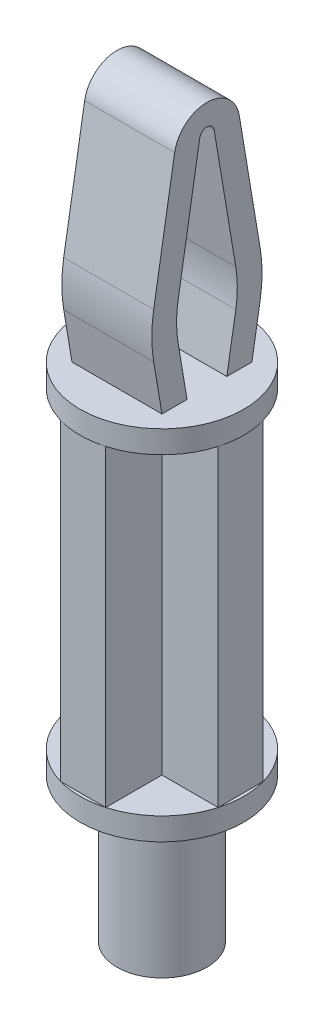
ISO-10303-21;
HEADER;
FILE_DESCRIPTION(('STEP AP214'),'2;1');
FILE_NAME('part.step','',(''),(''),'','','');
FILE_SCHEMA(('AUTOMOTIVE_DESIGN { 1 0 10303 214 1 1 1 1 }'));
ENDSEC;
DATA;
#1=APPLICATION_CONTEXT('core data for automotive mechanical design processes');
#2=APPLICATION_PROTOCOL_DEFINITION('international standard','automotive_design',2000,#1);
#3=PRODUCT_CONTEXT('',#1,'mechanical');
#4=PRODUCT('Part','Part','',(#3));
#5=PRODUCT_RELATED_PRODUCT_CATEGORY('part','',(#4));
#6=PRODUCT_DEFINITION_FORMATION('','',#4);
#7=PRODUCT_DEFINITION_CONTEXT('part definition',#1,'design');
#8=PRODUCT_DEFINITION('design','',#6,#7);
#9=PRODUCT_DEFINITION_SHAPE('','',#8);
#10=(LENGTH_UNIT() NAMED_UNIT(*) SI_UNIT(.MILLI.,.METRE.));
#11=(NAMED_UNIT(*) PLANE_ANGLE_UNIT() SI_UNIT($,.RADIAN.));
#12=(NAMED_UNIT(*) SI_UNIT($,.STERADIAN.) SOLID_ANGLE_UNIT());
#13=UNCERTAINTY_MEASURE_WITH_UNIT(LENGTH_MEASURE(1.E-05),#10,'distance_accuracy_value','');
#14=(GEOMETRIC_REPRESENTATION_CONTEXT(3) GLOBAL_UNCERTAINTY_ASSIGNED_CONTEXT((#13)) GLOBAL_UNIT_ASSIGNED_CONTEXT((#10,
#11,#12)) REPRESENTATION_CONTEXT('',''));
#15=CARTESIAN_POINT('',(0.,0.,0.));
#16=DIRECTION('',(0.,0.,1.));
#17=DIRECTION('',(1.,0.,0.));
#18=AXIS2_PLACEMENT_3D('',#15,#16,#17);
#19=CARTESIAN_POINT('',(0.999999999999998,6.95,-1.00000000000001));
#20=DIRECTION('',(-1.,0.,0.));
#21=DIRECTION('',(0.,0.,1.));
#22=AXIS2_PLACEMENT_3D('',#19,#20,#21);
#23=PLANE('',#22);
#24=DIRECTION('',(0.,0.,-1.));
#25=VECTOR('',#24,1.);
#26=CARTESIAN_POINT('',(0.999999999999998,-6.95,-1.00000000000001));
#27=LINE('',#26,#25);
#28=CARTESIAN_POINT('',(0.999999999999998,-6.95,-1.00000000000001));
#29=VERTEX_POINT('',#28);
#30=CARTESIAN_POINT('',(0.999999999999998,-6.95,-3.5));
#31=VERTEX_POINT('',#30);
#32=EDGE_CURVE('E259',#29,#31,#27,.T.);
#33=ORIENTED_EDGE('',*,*,#32,.T.);
#34=DIRECTION('',(0.,-1.,0.));
#35=VECTOR('',#34,1.);
#36=CARTESIAN_POINT('',(0.999999999999998,6.95,-3.50000000000001));
#37=LINE('',#36,#35);
#38=CARTESIAN_POINT('',(0.999999999999998,6.95,-3.50000000000001));
#39=VERTEX_POINT('',#38);
#40=EDGE_CURVE('E39',#39,#31,#37,.T.);
#41=ORIENTED_EDGE('',*,*,#40,.F.);
#42=DIRECTION('',(0.,0.,-1.));
#43=VECTOR('',#42,1.);
#44=CARTESIAN_POINT('',(0.999999999999998,6.95,-1.00000000000001));
#45=LINE('',#44,#43);
#46=CARTESIAN_POINT('',(0.999999999999998,6.95,-1.00000000000001));
#47=VERTEX_POINT('',#46);
#48=EDGE_CURVE('E264',#47,#39,#45,.T.);
#49=ORIENTED_EDGE('',*,*,#48,.F.);
#50=DIRECTION('',(0.,-1.,0.));
#51=VECTOR('',#50,1.);
#52=CARTESIAN_POINT('',(0.999999999999998,6.95,-1.00000000000001));
#53=LINE('',#52,#51);
#54=EDGE_CURVE('E301',#47,#29,#53,.T.);
#55=ORIENTED_EDGE('',*,*,#54,.T.);
#56=EDGE_LOOP('',(#33,#41,#49,#55));
#57=FACE_BOUND('',#56,.T.);
#58=ADVANCED_FACE('F32',(#57),#23,.F.);
#59=CARTESIAN_POINT('',(-1.,6.95,-3.50000000000001));
#60=DIRECTION('',(0.,0.,1.));
#61=DIRECTION('',(1.,0.,0.));
#62=AXIS2_PLACEMENT_3D('',#59,#60,#61);
#63=PLANE('',#62);
#64=DIRECTION('',(-1.,0.,0.));
#65=VECTOR('',#64,1.);
#66=CARTESIAN_POINT('',(-1.,-6.95,-3.50000000000001));
#67=LINE('',#66,#65);
#68=CARTESIAN_POINT('',(-1.,-6.95,-3.50000000000001));
#69=VERTEX_POINT('',#68);
#70=EDGE_CURVE('E304',#31,#69,#67,.T.);
#71=ORIENTED_EDGE('',*,*,#70,.T.);
#72=DIRECTION('',(0.,-1.,0.));
#73=VECTOR('',#72,1.);
#74=CARTESIAN_POINT('',(-1.,6.95,-3.50000000000001));
#75=LINE('',#74,#73);
#76=CARTESIAN_POINT('',(-1.,6.95,-3.50000000000001));
#77=VERTEX_POINT('',#76);
#78=EDGE_CURVE('E365',#77,#69,#75,.T.);
#79=ORIENTED_EDGE('',*,*,#78,.F.);
#80=DIRECTION('',(-1.,0.,0.));
#81=VECTOR('',#80,1.);
#82=CARTESIAN_POINT('',(-1.,6.95,-3.50000000000001));
#83=LINE('',#82,#81);
#84=EDGE_CURVE('E267',#39,#77,#83,.T.);
#85=ORIENTED_EDGE('',*,*,#84,.F.);
#86=ORIENTED_EDGE('',*,*,#40,.T.);
#87=EDGE_LOOP('',(#71,#79,#85,#86));
#88=FACE_BOUND('',#87,.T.);
#89=ADVANCED_FACE('F370',(#88),#63,.F.);
#90=CARTESIAN_POINT('',(-1.,6.95,-1.00000000000001));
#91=DIRECTION('',(1.,0.,0.));
#92=DIRECTION('',(0.,0.,-1.));
#93=AXIS2_PLACEMENT_3D('',#90,#91,#92);
#94=PLANE('',#93);
#95=DIRECTION('',(0.,0.,1.));
#96=VECTOR('',#95,1.);
#97=CARTESIAN_POINT('',(-1.,-6.95,-1.00000000000001));
#98=LINE('',#97,#96);
#99=CARTESIAN_POINT('',(-1.,-6.95,-1.00000000000001));
#100=VERTEX_POINT('',#99);
#101=EDGE_CURVE('E307',#69,#100,#98,.T.);
#102=ORIENTED_EDGE('',*,*,#101,.T.);
#103=DIRECTION('',(0.,-1.,0.));
#104=VECTOR('',#103,1.);
#105=CARTESIAN_POINT('',(-1.,6.95,-1.00000000000001));
#106=LINE('',#105,#104);
#107=CARTESIAN_POINT('',(-1.,6.95,-1.00000000000001));
#108=VERTEX_POINT('',#107);
#109=EDGE_CURVE('E362',#108,#100,#106,.T.);
#110=ORIENTED_EDGE('',*,*,#109,.F.);
#111=DIRECTION('',(0.,0.,1.));
#112=VECTOR('',#111,1.);
#113=CARTESIAN_POINT('',(-1.,6.95,-1.00000000000001));
#114=LINE('',#113,#112);
#115=EDGE_CURVE('E271',#77,#108,#114,.T.);
#116=ORIENTED_EDGE('',*,*,#115,.F.);
#117=ORIENTED_EDGE('',*,*,#78,.T.);
#118=EDGE_LOOP('',(#102,#110,#116,#117));
#119=FACE_BOUND('',#118,.T.);
#120=ADVANCED_FACE('F438',(#119),#94,.F.);
#121=CARTESIAN_POINT('',(-3.5,6.95,-1.00000000000001));
#122=DIRECTION('',(0.,0.,1.));
#123=DIRECTION('',(1.,0.,0.));
#124=AXIS2_PLACEMENT_3D('',#121,#122,#123);
#125=PLANE('',#124);
#126=DIRECTION('',(-1.,0.,0.));
#127=VECTOR('',#126,1.);
#128=CARTESIAN_POINT('',(-3.5,-6.95,-1.00000000000001));
#129=LINE('',#128,#127);
#130=CARTESIAN_POINT('',(-3.5,-6.95,-1.00000000000001));
#131=VERTEX_POINT('',#130);
#132=EDGE_CURVE('E310',#100,#131,#129,.T.);
#133=ORIENTED_EDGE('',*,*,#132,.T.);
#134=DIRECTION('',(0.,-1.,0.));
#135=VECTOR('',#134,1.);
#136=CARTESIAN_POINT('',(-3.5,6.95,-1.00000000000001));
#137=LINE('',#136,#135);
#138=CARTESIAN_POINT('',(-3.5,6.95,-1.00000000000001));
#139=VERTEX_POINT('',#138);
#140=EDGE_CURVE('E359',#139,#131,#137,.T.);
#141=ORIENTED_EDGE('',*,*,#140,.F.);
#142=DIRECTION('',(-1.,0.,0.));
#143=VECTOR('',#142,1.);
#144=CARTESIAN_POINT('',(-3.5,6.95,-1.00000000000001));
#145=LINE('',#144,#143);
#146=EDGE_CURVE('E274',#108,#139,#145,.T.);
#147=ORIENTED_EDGE('',*,*,#146,.F.);
#148=ORIENTED_EDGE('',*,*,#109,.T.);
#149=EDGE_LOOP('',(#133,#141,#147,#148));
#150=FACE_BOUND('',#149,.T.);
#151=ADVANCED_FACE('F434',(#150),#125,.F.);
#152=CARTESIAN_POINT('',(-3.5,6.95,-1.00000000000001));
#153=DIRECTION('',(1.,0.,0.));
#154=DIRECTION('',(0.,0.,-1.));
#155=AXIS2_PLACEMENT_3D('',#152,#153,#154);
#156=PLANE('',#155);
#157=DIRECTION('',(0.,0.,1.));
#158=VECTOR('',#157,1.);
#159=CARTESIAN_POINT('',(-3.5,-6.95,-1.00000000000001));
#160=LINE('',#159,#158);
#161=CARTESIAN_POINT('',(-3.5,-6.95,0.999999999999992));
#162=VERTEX_POINT('',#161);
#163=EDGE_CURVE('E313',#131,#162,#160,.T.);
#164=ORIENTED_EDGE('',*,*,#163,.T.);
#165=DIRECTION('',(0.,-1.,0.));
#166=VECTOR('',#165,1.);
#167=CARTESIAN_POINT('',(-3.5,6.95,0.999999999999993));
#168=LINE('',#167,#166);
#169=CARTESIAN_POINT('',(-3.5,6.95,0.999999999999993));
#170=VERTEX_POINT('',#169);
#171=EDGE_CURVE('E356',#170,#162,#168,.T.);
#172=ORIENTED_EDGE('',*,*,#171,.F.);
#173=DIRECTION('',(0.,0.,1.));
#174=VECTOR('',#173,1.);
#175=CARTESIAN_POINT('',(-3.5,6.95,-1.00000000000001));
#176=LINE('',#175,#174);
#177=EDGE_CURVE('E277',#139,#170,#176,.T.);
#178=ORIENTED_EDGE('',*,*,#177,.F.);
#179=ORIENTED_EDGE('',*,*,#140,.T.);
#180=EDGE_LOOP('',(#164,#172,#178,#179));
#181=FACE_BOUND('',#180,.T.);
#182=ADVANCED_FACE('F423',(#181),#156,.F.);
#183=CARTESIAN_POINT('',(-3.5,6.95,0.999999999999993));
#184=DIRECTION('',(0.,0.,-1.));
#185=DIRECTION('',(-1.,0.,0.));
#186=AXIS2_PLACEMENT_3D('',#183,#184,#185);
#187=PLANE('',#186);
#188=DIRECTION('',(1.,0.,0.));
#189=VECTOR('',#188,1.);
#190=CARTESIAN_POINT('',(-3.5,-6.95,0.999999999999993));
#191=LINE('',#190,#189);
#192=CARTESIAN_POINT('',(-1.,-6.95,0.999999999999993));
#193=VERTEX_POINT('',#192);
#194=EDGE_CURVE('E316',#162,#193,#191,.T.);
#195=ORIENTED_EDGE('',*,*,#194,.T.);
#196=DIRECTION('',(0.,-1.,0.));
#197=VECTOR('',#196,1.);
#198=CARTESIAN_POINT('',(-1.,6.95,0.999999999999993));
#199=LINE('',#198,#197);
#200=CARTESIAN_POINT('',(-1.,6.95,0.999999999999993));
#201=VERTEX_POINT('',#200);
#202=EDGE_CURVE('E353',#201,#193,#199,.T.);
#203=ORIENTED_EDGE('',*,*,#202,.F.);
#204=DIRECTION('',(1.,0.,0.));
#205=VECTOR('',#204,1.);
#206=CARTESIAN_POINT('',(-3.5,6.95,0.999999999999993));
#207=LINE('',#206,#205);
#208=EDGE_CURVE('E280',#170,#201,#207,.T.);
#209=ORIENTED_EDGE('',*,*,#208,.F.);
#210=ORIENTED_EDGE('',*,*,#171,.T.);
#211=EDGE_LOOP('',(#195,#203,#209,#210));
#212=FACE_BOUND('',#211,.T.);
#213=ADVANCED_FACE('F420',(#212),#187,.F.);
#214=CARTESIAN_POINT('',(-1.,6.95,3.49999999999999));
#215=DIRECTION('',(1.,0.,0.));
#216=DIRECTION('',(0.,0.,-1.));
#217=AXIS2_PLACEMENT_3D('',#214,#215,#216);
#218=PLANE('',#217);
#219=DIRECTION('',(0.,0.,1.));
#220=VECTOR('',#219,1.);
#221=CARTESIAN_POINT('',(-1.,-6.95,3.49999999999999));
#222=LINE('',#221,#220);
#223=CARTESIAN_POINT('',(-1.,-6.95,3.5));
#224=VERTEX_POINT('',#223);
#225=EDGE_CURVE('E319',#193,#224,#222,.T.);
#226=ORIENTED_EDGE('',*,*,#225,.T.);
#227=DIRECTION('',(0.,-1.,0.));
#228=VECTOR('',#227,1.);
#229=CARTESIAN_POINT('',(-1.,6.95,3.49999999999999));
#230=LINE('',#229,#228);
#231=CARTESIAN_POINT('',(-1.,6.95,3.49999999999999));
#232=VERTEX_POINT('',#231);
#233=EDGE_CURVE('E350',#232,#224,#230,.T.);
#234=ORIENTED_EDGE('',*,*,#233,.F.);
#235=DIRECTION('',(0.,0.,1.));
#236=VECTOR('',#235,1.);
#237=CARTESIAN_POINT('',(-1.,6.95,3.49999999999999));
#238=LINE('',#237,#236);
#239=EDGE_CURVE('E283',#201,#232,#238,.T.);
#240=ORIENTED_EDGE('',*,*,#239,.F.);
#241=ORIENTED_EDGE('',*,*,#202,.T.);
#242=EDGE_LOOP('',(#226,#234,#240,#241));
#243=FACE_BOUND('',#242,.T.);
#244=ADVANCED_FACE('F416',(#243),#218,.F.);
#245=CARTESIAN_POINT('',(-1.,6.95,3.49999999999999));
#246=DIRECTION('',(0.,0.,-1.));
#247=DIRECTION('',(-1.,0.,0.));
#248=AXIS2_PLACEMENT_3D('',#245,#246,#247);
#249=PLANE('',#248);
#250=DIRECTION('',(1.,0.,0.));
#251=VECTOR('',#250,1.);
#252=CARTESIAN_POINT('',(-1.,-6.95,3.49999999999999));
#253=LINE('',#252,#251);
#254=CARTESIAN_POINT('',(1.00000000000002,-6.95,3.49999999999999));
#255=VERTEX_POINT('',#254);
#256=EDGE_CURVE('E322',#224,#255,#253,.T.);
#257=ORIENTED_EDGE('',*,*,#256,.T.);
#258=DIRECTION('',(0.,-1.,0.));
#259=VECTOR('',#258,1.);
#260=CARTESIAN_POINT('',(0.999999999999998,6.95,3.49999999999999));
#261=LINE('',#260,#259);
#262=CARTESIAN_POINT('',(0.999999999999998,6.95,3.49999999999999));
#263=VERTEX_POINT('',#262);
#264=EDGE_CURVE('E347',#263,#255,#261,.T.);
#265=ORIENTED_EDGE('',*,*,#264,.F.);
#266=DIRECTION('',(1.,0.,0.));
#267=VECTOR('',#266,1.);
#268=CARTESIAN_POINT('',(-1.,6.95,3.49999999999999));
#269=LINE('',#268,#267);
#270=EDGE_CURVE('E286',#232,#263,#269,.T.);
#271=ORIENTED_EDGE('',*,*,#270,.F.);
#272=ORIENTED_EDGE('',*,*,#233,.T.);
#273=EDGE_LOOP('',(#257,#265,#271,#272));
#274=FACE_BOUND('',#273,.T.);
#275=ADVANCED_FACE('F404',(#274),#249,.F.);
#276=CARTESIAN_POINT('',(0.999999999999998,6.95,3.49999999999999));
#277=DIRECTION('',(-1.,0.,0.));
#278=DIRECTION('',(0.,0.,1.));
#279=AXIS2_PLACEMENT_3D('',#276,#277,#278);
#280=PLANE('',#279);
#281=DIRECTION('',(0.,0.,-1.));
#282=VECTOR('',#281,1.);
#283=CARTESIAN_POINT('',(0.999999999999998,-6.95,3.49999999999999));
#284=LINE('',#283,#282);
#285=CARTESIAN_POINT('',(0.999999999999998,-6.95,0.999999999999993));
#286=VERTEX_POINT('',#285);
#287=EDGE_CURVE('E325',#255,#286,#284,.T.);
#288=ORIENTED_EDGE('',*,*,#287,.T.);
#289=DIRECTION('',(0.,-1.,0.));
#290=VECTOR('',#289,1.);
#291=CARTESIAN_POINT('',(0.999999999999998,6.95,0.999999999999993));
#292=LINE('',#291,#290);
#293=CARTESIAN_POINT('',(0.999999999999998,6.95,0.999999999999993));
#294=VERTEX_POINT('',#293);
#295=EDGE_CURVE('E344',#294,#286,#292,.T.);
#296=ORIENTED_EDGE('',*,*,#295,.F.);
#297=DIRECTION('',(0.,0.,-1.));
#298=VECTOR('',#297,1.);
#299=CARTESIAN_POINT('',(0.999999999999998,6.95,3.49999999999999));
#300=LINE('',#299,#298);
#301=EDGE_CURVE('E289',#263,#294,#300,.T.);
#302=ORIENTED_EDGE('',*,*,#301,.F.);
#303=ORIENTED_EDGE('',*,*,#264,.T.);
#304=EDGE_LOOP('',(#288,#296,#302,#303));
#305=FACE_BOUND('',#304,.T.);
#306=ADVANCED_FACE('F401',(#305),#280,.F.);
#307=CARTESIAN_POINT('',(0.999999999999998,6.95,0.999999999999993));
#308=DIRECTION('',(0.,0.,-1.));
#309=DIRECTION('',(-1.,0.,0.));
#310=AXIS2_PLACEMENT_3D('',#307,#308,#309);
#311=PLANE('',#310);
#312=DIRECTION('',(1.,0.,0.));
#313=VECTOR('',#312,1.);
#314=CARTESIAN_POINT('',(0.999999999999998,-6.95,0.999999999999993));
#315=LINE('',#314,#313);
#316=CARTESIAN_POINT('',(3.5,-6.95,0.999999999999994));
#317=VERTEX_POINT('',#316);
#318=EDGE_CURVE('E328',#286,#317,#315,.T.);
#319=ORIENTED_EDGE('',*,*,#318,.T.);
#320=DIRECTION('',(0.,-1.,0.));
#321=VECTOR('',#320,1.);
#322=CARTESIAN_POINT('',(3.5,6.95,0.999999999999993));
#323=LINE('',#322,#321);
#324=CARTESIAN_POINT('',(3.5,6.95,0.999999999999993));
#325=VERTEX_POINT('',#324);
#326=EDGE_CURVE('E341',#325,#317,#323,.T.);
#327=ORIENTED_EDGE('',*,*,#326,.F.);
#328=DIRECTION('',(1.,0.,0.));
#329=VECTOR('',#328,1.);
#330=CARTESIAN_POINT('',(0.999999999999998,6.95,0.999999999999993));
#331=LINE('',#330,#329);
#332=EDGE_CURVE('E292',#294,#325,#331,.T.);
#333=ORIENTED_EDGE('',*,*,#332,.F.);
#334=ORIENTED_EDGE('',*,*,#295,.T.);
#335=EDGE_LOOP('',(#319,#327,#333,#334));
#336=FACE_BOUND('',#335,.T.);
#337=ADVANCED_FACE('F397',(#336),#311,.F.);
#338=CARTESIAN_POINT('',(3.5,6.95,-1.00000000000001));
#339=DIRECTION('',(-1.,0.,0.));
#340=DIRECTION('',(0.,0.,1.));
#341=AXIS2_PLACEMENT_3D('',#338,#339,#340);
#342=PLANE('',#341);
#343=DIRECTION('',(0.,0.,-1.));
#344=VECTOR('',#343,1.);
#345=CARTESIAN_POINT('',(3.5,-6.95,-1.00000000000001));
#346=LINE('',#345,#344);
#347=CARTESIAN_POINT('',(3.5,-6.95,-1.00000000000001));
#348=VERTEX_POINT('',#347);
#349=EDGE_CURVE('E331',#317,#348,#346,.T.);
#350=ORIENTED_EDGE('',*,*,#349,.T.);
#351=DIRECTION('',(0.,-1.,0.));
#352=VECTOR('',#351,1.);
#353=CARTESIAN_POINT('',(3.5,6.95,-1.00000000000001));
#354=LINE('',#353,#352);
#355=CARTESIAN_POINT('',(3.5,6.95,-1.00000000000001));
#356=VERTEX_POINT('',#355);
#357=EDGE_CURVE('E338',#356,#348,#354,.T.);
#358=ORIENTED_EDGE('',*,*,#357,.F.);
#359=DIRECTION('',(0.,0.,-1.));
#360=VECTOR('',#359,1.);
#361=CARTESIAN_POINT('',(3.5,6.95,-1.00000000000001));
#362=LINE('',#361,#360);
#363=EDGE_CURVE('E295',#325,#356,#362,.T.);
#364=ORIENTED_EDGE('',*,*,#363,.F.);
#365=ORIENTED_EDGE('',*,*,#326,.T.);
#366=EDGE_LOOP('',(#350,#358,#364,#365));
#367=FACE_BOUND('',#366,.T.);
#368=ADVANCED_FACE('F383',(#367),#342,.F.);
#369=CARTESIAN_POINT('',(0.999999999999998,6.95,-1.00000000000001));
#370=DIRECTION('',(0.,0.,1.));
#371=DIRECTION('',(1.,0.,0.));
#372=AXIS2_PLACEMENT_3D('',#369,#370,#371);
#373=PLANE('',#372);
#374=DIRECTION('',(-1.,0.,0.));
#375=VECTOR('',#374,1.);
#376=CARTESIAN_POINT('',(0.999999999999998,-6.95,-1.00000000000001));
#377=LINE('',#376,#375);
#378=EDGE_CURVE('E268',#348,#29,#377,.T.);
#379=ORIENTED_EDGE('',*,*,#378,.T.);
#380=ORIENTED_EDGE('',*,*,#54,.F.);
#381=DIRECTION('',(-1.,0.,0.));
#382=VECTOR('',#381,1.);
#383=CARTESIAN_POINT('',(0.999999999999998,6.95,-1.00000000000001));
#384=LINE('',#383,#382);
#385=EDGE_CURVE('E298',#356,#47,#384,.T.);
#386=ORIENTED_EDGE('',*,*,#385,.F.);
#387=ORIENTED_EDGE('',*,*,#357,.T.);
#388=EDGE_LOOP('',(#379,#380,#386,#387));
#389=FACE_BOUND('',#388,.T.);
#390=ADVANCED_FACE('F379',(#389),#373,.F.);
#391=CARTESIAN_POINT('',(0.,6.95,0.));
#392=DIRECTION('',(0.,1.,0.));
#393=DIRECTION('',(0.,0.,1.));
#394=AXIS2_PLACEMENT_3D('',#391,#392,#393);
#395=PLANE('',#394);
#396=ORIENTED_EDGE('',*,*,#385,.T.);
#397=ORIENTED_EDGE('',*,*,#48,.T.);
#398=CARTESIAN_POINT('',(0.,6.95,0.));
#399=DIRECTION('',(0.,1.,0.));
#400=DIRECTION('',(0.,0.,1.));
#401=AXIS2_PLACEMENT_3D('',#398,#399,#400);
#402=CIRCLE('',#401,3.64005494464026);
#403=EDGE_CURVE('E457',#356,#39,#402,.T.);
#404=ORIENTED_EDGE('',*,*,#403,.F.);
#405=EDGE_LOOP('',(#396,#397,#404));
#406=FACE_BOUND('',#405,.T.);
#407=ADVANCED_FACE('F464',(#406),#395,.F.);
#408=EDGE_CURVE('E445',#39,#77,#402,.T.);
#409=ORIENTED_EDGE('',*,*,#408,.F.);
#410=ORIENTED_EDGE('',*,*,#84,.T.);
#411=EDGE_LOOP('',(#409,#410));
#412=FACE_BOUND('',#411,.T.);
#413=ADVANCED_FACE('F443',(#412),#395,.F.);
#414=EDGE_CURVE('E448',#77,#139,#402,.T.);
#415=ORIENTED_EDGE('',*,*,#414,.F.);
#416=ORIENTED_EDGE('',*,*,#115,.T.);
#417=ORIENTED_EDGE('',*,*,#146,.T.);
#418=EDGE_LOOP('',(#415,#416,#417));
#419=FACE_BOUND('',#418,.T.);
#420=ADVANCED_FACE('F449',(#419),#395,.F.);
#421=EDGE_CURVE('E453',#139,#170,#402,.T.);
#422=ORIENTED_EDGE('',*,*,#421,.F.);
#423=ORIENTED_EDGE('',*,*,#177,.T.);
#424=EDGE_LOOP('',(#422,#423));
#425=FACE_BOUND('',#424,.T.);
#426=ADVANCED_FACE('F773',(#425),#395,.F.);
#427=EDGE_CURVE('E873',#170,#232,#402,.T.);
#428=ORIENTED_EDGE('',*,*,#427,.F.);
#429=ORIENTED_EDGE('',*,*,#208,.T.);
#430=ORIENTED_EDGE('',*,*,#239,.T.);
#431=EDGE_LOOP('',(#428,#429,#430));
#432=FACE_BOUND('',#431,.T.);
#433=ADVANCED_FACE('F765',(#432),#395,.F.);
#434=EDGE_CURVE('E251',#232,#263,#402,.T.);
#435=ORIENTED_EDGE('',*,*,#434,.F.);
#436=ORIENTED_EDGE('',*,*,#270,.T.);
#437=EDGE_LOOP('',(#435,#436));
#438=FACE_BOUND('',#437,.T.);
#439=ADVANCED_FACE('F757',(#438),#395,.F.);
#440=EDGE_CURVE('E260',#263,#325,#402,.T.);
#441=ORIENTED_EDGE('',*,*,#440,.F.);
#442=ORIENTED_EDGE('',*,*,#301,.T.);
#443=ORIENTED_EDGE('',*,*,#332,.T.);
#444=EDGE_LOOP('',(#441,#442,#443));
#445=FACE_BOUND('',#444,.T.);
#446=ADVANCED_FACE('F475',(#445),#395,.F.);
#447=EDGE_CURVE('E263',#325,#356,#402,.T.);
#448=ORIENTED_EDGE('',*,*,#447,.F.);
#449=ORIENTED_EDGE('',*,*,#363,.T.);
#450=EDGE_LOOP('',(#448,#449));
#451=FACE_BOUND('',#450,.T.);
#452=ADVANCED_FACE('F462',(#451),#395,.F.);
#453=CARTESIAN_POINT('',(0.,7.95,0.));
#454=DIRECTION('',(0.,-1.,0.));
#455=DIRECTION('',(0.,0.,-1.));
#456=AXIS2_PLACEMENT_3D('',#453,#454,#455);
#457=CYLINDRICAL_SURFACE('',#456,3.64005494464026);
#458=CARTESIAN_POINT('',(0.,7.95,0.));
#459=DIRECTION('',(0.,1.,0.));
#460=DIRECTION('',(0.,0.,1.));
#461=AXIS2_PLACEMENT_3D('',#458,#459,#460);
#462=CIRCLE('',#461,3.64005494464026);
#463=CARTESIAN_POINT('',(0.,7.95,3.64005494464026));
#464=VERTEX_POINT('',#463);
#465=EDGE_CURVE('E256',#464,#464,#462,.T.);
#466=ORIENTED_EDGE('',*,*,#465,.F.);
#467=EDGE_LOOP('',(#466));
#468=FACE_BOUND('',#467,.T.);
#469=ORIENTED_EDGE('',*,*,#440,.T.);
#470=ORIENTED_EDGE('',*,*,#447,.T.);
#471=ORIENTED_EDGE('',*,*,#403,.T.);
#472=ORIENTED_EDGE('',*,*,#408,.T.);
#473=ORIENTED_EDGE('',*,*,#414,.T.);
#474=ORIENTED_EDGE('',*,*,#421,.T.);
#475=ORIENTED_EDGE('',*,*,#427,.T.);
#476=ORIENTED_EDGE('',*,*,#434,.T.);
#477=EDGE_LOOP('',(#469,#470,#471,#472,#473,#474,#475,#476));
#478=FACE_BOUND('',#477,.T.);
#479=ADVANCED_FACE('F454',(#468,#478),#457,.T.);
#480=CARTESIAN_POINT('',(0.,7.95,0.));
#481=DIRECTION('',(0.,1.,0.));
#482=DIRECTION('',(0.,0.,1.));
#483=AXIS2_PLACEMENT_3D('',#480,#481,#482);
#484=PLANE('',#483);
#485=DIRECTION('',(0.,0.,-1.));
#486=VECTOR('',#485,1.);
#487=CARTESIAN_POINT('',(2.,7.95,2.));
#488=LINE('',#487,#486);
#489=CARTESIAN_POINT('',(2.,7.95,2.));
#490=VERTEX_POINT('',#489);
#491=CARTESIAN_POINT('',(2.,7.95,0.884760215263712));
#492=VERTEX_POINT('',#491);
#493=EDGE_CURVE('E223',#490,#492,#488,.T.);
#494=ORIENTED_EDGE('',*,*,#493,.F.);
#495=DIRECTION('',(-1.,0.,0.));
#496=VECTOR('',#495,1.);
#497=CARTESIAN_POINT('',(2.,7.95,2.));
#498=LINE('',#497,#496);
#499=CARTESIAN_POINT('',(-2.,7.95,2.));
#500=VERTEX_POINT('',#499);
#501=EDGE_CURVE('E905',#490,#500,#498,.T.);
#502=ORIENTED_EDGE('',*,*,#501,.T.);
#503=DIRECTION('',(0.,0.,-1.));
#504=VECTOR('',#503,1.);
#505=CARTESIAN_POINT('',(-2.,7.95,2.));
#506=LINE('',#505,#504);
#507=CARTESIAN_POINT('',(-2.,7.95,0.884760215263712));
#508=VERTEX_POINT('',#507);
#509=EDGE_CURVE('E238',#500,#508,#506,.T.);
#510=ORIENTED_EDGE('',*,*,#509,.T.);
#511=DIRECTION('',(-1.,0.,0.));
#512=VECTOR('',#511,1.);
#513=CARTESIAN_POINT('',(2.,7.95,0.884760215263712));
#514=LINE('',#513,#512);
#515=EDGE_CURVE('E46',#492,#508,#514,.T.);
#516=ORIENTED_EDGE('',*,*,#515,.F.);
#517=EDGE_LOOP('',(#494,#502,#510,#516));
#518=FACE_BOUND('',#517,.T.);
#519=DIRECTION('',(0.,0.,-1.));
#520=VECTOR('',#519,1.);
#521=CARTESIAN_POINT('',(2.,7.95,-0.884760215263712));
#522=LINE('',#521,#520);
#523=CARTESIAN_POINT('',(2.,7.95,-0.884760215263712));
#524=VERTEX_POINT('',#523);
#525=CARTESIAN_POINT('',(2.,7.95,-2.));
#526=VERTEX_POINT('',#525);
#527=EDGE_CURVE('E999',#524,#526,#522,.T.);
#528=ORIENTED_EDGE('',*,*,#527,.F.);
#529=DIRECTION('',(-1.,0.,0.));
#530=VECTOR('',#529,1.);
#531=CARTESIAN_POINT('',(2.,7.95,-0.884760215263712));
#532=LINE('',#531,#530);
#533=CARTESIAN_POINT('',(-2.,7.95,-0.884760215263712));
#534=VERTEX_POINT('',#533);
#535=EDGE_CURVE('E932',#524,#534,#532,.T.);
#536=ORIENTED_EDGE('',*,*,#535,.T.);
#537=DIRECTION('',(0.,0.,-1.));
#538=VECTOR('',#537,1.);
#539=CARTESIAN_POINT('',(-2.,7.95,-0.884760215263712));
#540=LINE('',#539,#538);
#541=CARTESIAN_POINT('',(-2.,7.95,-2.));
#542=VERTEX_POINT('',#541);
#543=EDGE_CURVE('E968',#534,#542,#540,.T.);
#544=ORIENTED_EDGE('',*,*,#543,.T.);
#545=DIRECTION('',(-1.,0.,0.));
#546=VECTOR('',#545,1.);
#547=CARTESIAN_POINT('',(2.,7.95,-2.));
#548=LINE('',#547,#546);
#549=EDGE_CURVE('E930',#526,#542,#548,.T.);
#550=ORIENTED_EDGE('',*,*,#549,.F.);
#551=EDGE_LOOP('',(#528,#536,#544,#550));
#552=FACE_BOUND('',#551,.T.);
#553=ORIENTED_EDGE('',*,*,#465,.T.);
#554=EDGE_LOOP('',(#553));
#555=FACE_BOUND('',#554,.T.);
#556=ADVANCED_FACE('F235',(#518,#552,#555),#484,.T.);
#557=CARTESIAN_POINT('',(0.,-6.95,0.));
#558=DIRECTION('',(0.,-1.,0.));
#559=DIRECTION('',(0.,0.,1.));
#560=AXIS2_PLACEMENT_3D('',#557,#558,#559);
#561=PLANE('',#560);
#562=ORIENTED_EDGE('',*,*,#32,.F.);
#563=ORIENTED_EDGE('',*,*,#378,.F.);
#564=CARTESIAN_POINT('',(0.,-6.95,0.));
#565=DIRECTION('',(0.,1.,0.));
#566=DIRECTION('',(0.,0.,1.));
#567=AXIS2_PLACEMENT_3D('',#564,#565,#566);
#568=CIRCLE('',#567,3.64005494464026);
#569=EDGE_CURVE('E377',#348,#31,#568,.T.);
#570=ORIENTED_EDGE('',*,*,#569,.T.);
#571=EDGE_LOOP('',(#562,#563,#570));
#572=FACE_BOUND('',#571,.T.);
#573=ADVANCED_FACE('F375',(#572),#561,.F.);
#574=ORIENTED_EDGE('',*,*,#349,.F.);
#575=EDGE_CURVE('E255',#317,#348,#568,.T.);
#576=ORIENTED_EDGE('',*,*,#575,.T.);
#577=EDGE_LOOP('',(#574,#576));
#578=FACE_BOUND('',#577,.T.);
#579=ADVANCED_FACE('F387',(#578),#561,.F.);
#580=ORIENTED_EDGE('',*,*,#318,.F.);
#581=ORIENTED_EDGE('',*,*,#287,.F.);
#582=EDGE_CURVE('E252',#255,#317,#568,.T.);
#583=ORIENTED_EDGE('',*,*,#582,.T.);
#584=EDGE_LOOP('',(#580,#581,#583));
#585=FACE_BOUND('',#584,.T.);
#586=ADVANCED_FACE('F394',(#585),#561,.F.);
#587=ORIENTED_EDGE('',*,*,#256,.F.);
#588=EDGE_CURVE('E242',#224,#255,#568,.T.);
#589=ORIENTED_EDGE('',*,*,#588,.T.);
#590=EDGE_LOOP('',(#587,#589));
#591=FACE_BOUND('',#590,.T.);
#592=ADVANCED_FACE('F406',(#591),#561,.F.);
#593=ORIENTED_EDGE('',*,*,#225,.F.);
#594=ORIENTED_EDGE('',*,*,#194,.F.);
#595=EDGE_CURVE('E410',#162,#224,#568,.T.);
#596=ORIENTED_EDGE('',*,*,#595,.T.);
#597=EDGE_LOOP('',(#593,#594,#596));
#598=FACE_BOUND('',#597,.T.);
#599=ADVANCED_FACE('F413',(#598),#561,.F.);
#600=ORIENTED_EDGE('',*,*,#163,.F.);
#601=EDGE_CURVE('E414',#131,#162,#568,.T.);
#602=ORIENTED_EDGE('',*,*,#601,.T.);
#603=EDGE_LOOP('',(#600,#602));
#604=FACE_BOUND('',#603,.T.);
#605=ADVANCED_FACE('F425',(#604),#561,.F.);
#606=ORIENTED_EDGE('',*,*,#132,.F.);
#607=ORIENTED_EDGE('',*,*,#101,.F.);
#608=EDGE_CURVE('E428',#69,#131,#568,.T.);
#609=ORIENTED_EDGE('',*,*,#608,.T.);
#610=EDGE_LOOP('',(#606,#607,#609));
#611=FACE_BOUND('',#610,.T.);
#612=ADVANCED_FACE('F431',(#611),#561,.F.);
#613=CARTESIAN_POINT('',(0.,-7.95,0.));
#614=DIRECTION('',(0.,1.,0.));
#615=DIRECTION('',(0.,0.,1.));
#616=AXIS2_PLACEMENT_3D('',#613,#614,#615);
#617=CYLINDRICAL_SURFACE('',#616,3.64005494464026);
#618=CARTESIAN_POINT('',(0.,-7.95,0.));
#619=DIRECTION('',(0.,1.,0.));
#620=DIRECTION('',(0.,0.,1.));
#621=AXIS2_PLACEMENT_3D('',#618,#619,#620);
#622=CIRCLE('',#621,3.64005494464026);
#623=CARTESIAN_POINT('',(0.,-7.95,3.64005494464026));
#624=VERTEX_POINT('',#623);
#625=EDGE_CURVE('E248',#624,#624,#622,.T.);
#626=ORIENTED_EDGE('',*,*,#625,.T.);
#627=EDGE_LOOP('',(#626));
#628=FACE_BOUND('',#627,.T.);
#629=ORIENTED_EDGE('',*,*,#582,.F.);
#630=ORIENTED_EDGE('',*,*,#588,.F.);
#631=ORIENTED_EDGE('',*,*,#595,.F.);
#632=ORIENTED_EDGE('',*,*,#601,.F.);
#633=ORIENTED_EDGE('',*,*,#608,.F.);
#634=EDGE_CURVE('E432',#31,#69,#568,.T.);
#635=ORIENTED_EDGE('',*,*,#634,.F.);
#636=ORIENTED_EDGE('',*,*,#569,.F.);
#637=ORIENTED_EDGE('',*,*,#575,.F.);
#638=EDGE_LOOP('',(#629,#630,#631,#632,#633,#635,#636,#637));
#639=FACE_BOUND('',#638,.T.);
#640=ADVANCED_FACE('F390',(#628,#639),#617,.T.);
#641=CARTESIAN_POINT('',(0.,-7.95,0.));
#642=DIRECTION('',(0.,-1.,0.));
#643=DIRECTION('',(0.,0.,1.));
#644=AXIS2_PLACEMENT_3D('',#641,#642,#643);
#645=PLANE('',#644);
#646=CARTESIAN_POINT('',(0.,-7.95,0.));
#647=DIRECTION('',(0.,-1.,0.));
#648=DIRECTION('',(0.,0.,-1.));
#649=AXIS2_PLACEMENT_3D('',#646,#647,#648);
#650=CIRCLE('',#649,2.);
#651=CARTESIAN_POINT('',(0.,-7.95,-2.));
#652=VERTEX_POINT('',#651);
#653=EDGE_CURVE('E11',#652,#652,#650,.T.);
#654=ORIENTED_EDGE('',*,*,#653,.F.);
#655=EDGE_LOOP('',(#654));
#656=FACE_BOUND('',#655,.T.);
#657=ORIENTED_EDGE('',*,*,#625,.F.);
#658=EDGE_LOOP('',(#657));
#659=FACE_BOUND('',#658,.T.);
#660=ADVANCED_FACE('F514',(#656,#659),#645,.T.);
#661=ORIENTED_EDGE('',*,*,#70,.F.);
#662=ORIENTED_EDGE('',*,*,#634,.T.);
#663=EDGE_LOOP('',(#661,#662));
#664=FACE_BOUND('',#663,.T.);
#665=ADVANCED_FACE('F511',(#664),#561,.F.);
#666=CARTESIAN_POINT('',(0.,-14.35,0.));
#667=DIRECTION('',(0.,1.,0.));
#668=DIRECTION('',(0.,0.,1.));
#669=AXIS2_PLACEMENT_3D('',#666,#667,#668);
#670=CYLINDRICAL_SURFACE('',#669,2.);
#671=CARTESIAN_POINT('',(0.,-14.35,0.));
#672=DIRECTION('',(0.,1.,0.));
#673=DIRECTION('',(0.,0.,1.));
#674=AXIS2_PLACEMENT_3D('',#671,#672,#673);
#675=CIRCLE('',#674,2.);
#676=CARTESIAN_POINT('',(0.,-14.35,2.));
#677=VERTEX_POINT('',#676);
#678=EDGE_CURVE('E239',#677,#677,#675,.T.);
#679=ORIENTED_EDGE('',*,*,#678,.T.);
#680=EDGE_LOOP('',(#679));
#681=FACE_BOUND('',#680,.T.);
#682=ORIENTED_EDGE('',*,*,#653,.T.);
#683=EDGE_LOOP('',(#682));
#684=FACE_BOUND('',#683,.T.);
#685=ADVANCED_FACE('F518',(#681,#684),#670,.T.);
#686=CARTESIAN_POINT('',(0.,-14.35,0.));
#687=DIRECTION('',(0.,1.,0.));
#688=DIRECTION('',(0.,0.,1.));
#689=AXIS2_PLACEMENT_3D('',#686,#687,#688);
#690=PLANE('',#689);
#691=ORIENTED_EDGE('',*,*,#678,.F.);
#692=EDGE_LOOP('',(#691));
#693=FACE_BOUND('',#692,.T.);
#694=ADVANCED_FACE('F525',(#693),#690,.F.);
#695=CARTESIAN_POINT('',(2.,7.95,0.884760215263712));
#696=DIRECTION('',(0.,-0.164752317993209,0.98633497034013));
#697=DIRECTION('',(0.,-0.98633497034013,-0.164752317993209));
#698=AXIS2_PLACEMENT_3D('',#695,#696,#697);
#699=PLANE('',#698);
#700=DIRECTION('',(0.,0.98633497034013,0.164752317993209));
#701=VECTOR('',#700,1.);
#702=CARTESIAN_POINT('',(-2.,7.95,0.884760215263712));
#703=LINE('',#702,#701);
#704=CARTESIAN_POINT('',(-2.,10.326238410034,1.28167485170065));
#705=VERTEX_POINT('',#704);
#706=EDGE_CURVE('E903',#508,#705,#703,.T.);
#707=ORIENTED_EDGE('',*,*,#706,.T.);
#708=DIRECTION('',(-1.,0.,0.));
#709=VECTOR('',#708,1.);
#710=CARTESIAN_POINT('',(2.,10.326238410034,1.28167485170065));
#711=LINE('',#710,#709);
#712=CARTESIAN_POINT('',(2.,10.326238410034,1.28167485170065));
#713=VERTEX_POINT('',#712);
#714=EDGE_CURVE('E219',#713,#705,#711,.T.);
#715=ORIENTED_EDGE('',*,*,#714,.F.);
#716=DIRECTION('',(0.,0.98633497034013,0.164752317993209));
#717=VECTOR('',#716,1.);
#718=CARTESIAN_POINT('',(2.,7.95,0.884760215263712));
#719=LINE('',#718,#717);
#720=EDGE_CURVE('E215',#492,#713,#719,.T.);
#721=ORIENTED_EDGE('',*,*,#720,.F.);
#722=ORIENTED_EDGE('',*,*,#515,.T.);
#723=EDGE_LOOP('',(#707,#715,#721,#722));
#724=FACE_BOUND('',#723,.T.);
#725=ADVANCED_FACE('F217',(#724),#699,.F.);
#726=CARTESIAN_POINT('',(2.,11.15,-3.65));
#727=DIRECTION('',(-1.,0.,0.));
#728=DIRECTION('',(0.,0.,1.));
#729=AXIS2_PLACEMENT_3D('',#726,#727,#728);
#730=CYLINDRICAL_SURFACE('',#729,5.);
#731=CARTESIAN_POINT('',(-2.,11.15,-3.65));
#732=DIRECTION('',(-1.,0.,0.));
#733=DIRECTION('',(0.,0.,-1.));
#734=AXIS2_PLACEMENT_3D('',#731,#732,#733);
#735=CIRCLE('',#734,5.);
#736=CARTESIAN_POINT('',(-2.,11.973761589966,1.28167485170065));
#737=VERTEX_POINT('',#736);
#738=EDGE_CURVE('E954',#705,#737,#735,.T.);
#739=ORIENTED_EDGE('',*,*,#738,.T.);
#740=DIRECTION('',(-1.,0.,0.));
#741=VECTOR('',#740,1.);
#742=CARTESIAN_POINT('',(2.,11.973761589966,1.28167485170065));
#743=LINE('',#742,#741);
#744=CARTESIAN_POINT('',(2.,11.973761589966,1.28167485170065));
#745=VERTEX_POINT('',#744);
#746=EDGE_CURVE('E244',#745,#737,#743,.T.);
#747=ORIENTED_EDGE('',*,*,#746,.F.);
#748=CARTESIAN_POINT('',(2.,11.15,-3.65));
#749=DIRECTION('',(-1.,0.,0.));
#750=DIRECTION('',(0.,0.,-1.));
#751=AXIS2_PLACEMENT_3D('',#748,#749,#750);
#752=CIRCLE('',#751,5.);
#753=EDGE_CURVE('E222',#713,#745,#752,.T.);
#754=ORIENTED_EDGE('',*,*,#753,.F.);
#755=ORIENTED_EDGE('',*,*,#714,.T.);
#756=EDGE_LOOP('',(#739,#747,#754,#755));
#757=FACE_BOUND('',#756,.T.);
#758=ADVANCED_FACE('F532',(#757),#730,.F.);
#759=CARTESIAN_POINT('',(2.,11.973761589966,1.28167485170065));
#760=DIRECTION('',(0.,0.164752317993209,0.98633497034013));
#761=DIRECTION('',(0.,-0.98633497034013,0.164752317993209));
#762=AXIS2_PLACEMENT_3D('',#759,#760,#761);
#763=PLANE('',#762);
#764=DIRECTION('',(0.,0.98633497034013,-0.164752317993209));
#765=VECTOR('',#764,1.);
#766=CARTESIAN_POINT('',(-2.,11.973761589966,1.28167485170065));
#767=LINE('',#766,#765);
#768=CARTESIAN_POINT('',(-2.,17.7282408756031,0.320476243051826));
#769=VERTEX_POINT('',#768);
#770=EDGE_CURVE('E951',#737,#769,#767,.T.);
#771=ORIENTED_EDGE('',*,*,#770,.T.);
#772=DIRECTION('',(-1.,0.,0.));
#773=VECTOR('',#772,1.);
#774=CARTESIAN_POINT('',(2.,17.7282408756031,0.320476243051826));
#775=LINE('',#774,#773);
#776=CARTESIAN_POINT('',(2.,17.7282408756031,0.320476243051826));
#777=VERTEX_POINT('',#776);
#778=EDGE_CURVE('E944',#777,#769,#775,.T.);
#779=ORIENTED_EDGE('',*,*,#778,.F.);
#780=DIRECTION('',(0.,0.98633497034013,-0.164752317993209));
#781=VECTOR('',#780,1.);
#782=CARTESIAN_POINT('',(2.,11.973761589966,1.28167485170065));
#783=LINE('',#782,#781);
#784=EDGE_CURVE('E952',#745,#777,#783,.T.);
#785=ORIENTED_EDGE('',*,*,#784,.F.);
#786=ORIENTED_EDGE('',*,*,#746,.T.);
#787=EDGE_LOOP('',(#771,#779,#785,#786));
#788=FACE_BOUND('',#787,.T.);
#789=ADVANCED_FACE('F535',(#788),#763,.F.);
#790=CARTESIAN_POINT('',(2.,17.6747101730606,0.));
#791=DIRECTION('',(-1.,0.,0.));
#792=DIRECTION('',(0.,0.,1.));
#793=AXIS2_PLACEMENT_3D('',#790,#791,#792);
#794=CYLINDRICAL_SURFACE('',#793,0.324916233012921);
#795=CARTESIAN_POINT('',(-2.,17.6747101730606,0.));
#796=DIRECTION('',(-1.,0.,0.));
#797=DIRECTION('',(0.,0.,1.));
#798=AXIS2_PLACEMENT_3D('',#795,#796,#797);
#799=CIRCLE('',#798,0.324916233012921);
#800=CARTESIAN_POINT('',(-2.,17.7282408756031,-0.320476243051826));
#801=VERTEX_POINT('',#800);
#802=EDGE_CURVE('E956',#769,#801,#799,.T.);
#803=ORIENTED_EDGE('',*,*,#802,.T.);
#804=DIRECTION('',(-1.,0.,0.));
#805=VECTOR('',#804,1.);
#806=CARTESIAN_POINT('',(2.,17.7282408756031,-0.320476243051826));
#807=LINE('',#806,#805);
#808=CARTESIAN_POINT('',(2.,17.7282408756031,-0.320476243051826));
#809=VERTEX_POINT('',#808);
#810=EDGE_CURVE('E941',#809,#801,#807,.T.);
#811=ORIENTED_EDGE('',*,*,#810,.F.);
#812=CARTESIAN_POINT('',(2.,17.6747101730606,0.));
#813=DIRECTION('',(-1.,0.,0.));
#814=DIRECTION('',(0.,0.,1.));
#815=AXIS2_PLACEMENT_3D('',#812,#813,#814);
#816=CIRCLE('',#815,0.324916233012921);
#817=EDGE_CURVE('E989',#777,#809,#816,.T.);
#818=ORIENTED_EDGE('',*,*,#817,.F.);
#819=ORIENTED_EDGE('',*,*,#778,.T.);
#820=EDGE_LOOP('',(#803,#811,#818,#819));
#821=FACE_BOUND('',#820,.T.);
#822=ADVANCED_FACE('F539',(#821),#794,.F.);
#823=CARTESIAN_POINT('',(2.,11.973761589966,-1.28167485170065));
#824=DIRECTION('',(0.,0.164752317993209,-0.98633497034013));
#825=DIRECTION('',(0.,0.98633497034013,0.164752317993209));
#826=AXIS2_PLACEMENT_3D('',#823,#824,#825);
#827=PLANE('',#826);
#828=DIRECTION('',(0.,-0.98633497034013,-0.164752317993209));
#829=VECTOR('',#828,1.);
#830=CARTESIAN_POINT('',(-2.,11.973761589966,-1.28167485170065));
#831=LINE('',#830,#829);
#832=CARTESIAN_POINT('',(-2.,11.973761589966,-1.28167485170065));
#833=VERTEX_POINT('',#832);
#834=EDGE_CURVE('E958',#801,#833,#831,.T.);
#835=ORIENTED_EDGE('',*,*,#834,.T.);
#836=DIRECTION('',(-1.,0.,0.));
#837=VECTOR('',#836,1.);
#838=CARTESIAN_POINT('',(2.,11.973761589966,-1.28167485170065));
#839=LINE('',#838,#837);
#840=CARTESIAN_POINT('',(2.,11.973761589966,-1.28167485170065));
#841=VERTEX_POINT('',#840);
#842=EDGE_CURVE('E938',#841,#833,#839,.T.);
#843=ORIENTED_EDGE('',*,*,#842,.F.);
#844=DIRECTION('',(0.,-0.98633497034013,-0.164752317993209));
#845=VECTOR('',#844,1.);
#846=CARTESIAN_POINT('',(2.,11.973761589966,-1.28167485170065));
#847=LINE('',#846,#845);
#848=EDGE_CURVE('E993',#809,#841,#847,.T.);
#849=ORIENTED_EDGE('',*,*,#848,.F.);
#850=ORIENTED_EDGE('',*,*,#810,.T.);
#851=EDGE_LOOP('',(#835,#843,#849,#850));
#852=FACE_BOUND('',#851,.T.);
#853=ADVANCED_FACE('F543',(#852),#827,.F.);
#854=CARTESIAN_POINT('',(2.,11.15,3.65));
#855=DIRECTION('',(-1.,0.,0.));
#856=DIRECTION('',(0.,0.,1.));
#857=AXIS2_PLACEMENT_3D('',#854,#855,#856);
#858=CYLINDRICAL_SURFACE('',#857,5.);
#859=CARTESIAN_POINT('',(-2.,11.15,3.65));
#860=DIRECTION('',(-1.,0.,0.));
#861=DIRECTION('',(0.,0.,1.));
#862=AXIS2_PLACEMENT_3D('',#859,#860,#861);
#863=CIRCLE('',#862,5.);
#864=CARTESIAN_POINT('',(-2.,10.326238410034,-1.28167485170065));
#865=VERTEX_POINT('',#864);
#866=EDGE_CURVE('E964',#833,#865,#863,.T.);
#867=ORIENTED_EDGE('',*,*,#866,.T.);
#868=DIRECTION('',(-1.,0.,0.));
#869=VECTOR('',#868,1.);
#870=CARTESIAN_POINT('',(2.,10.326238410034,-1.28167485170065));
#871=LINE('',#870,#869);
#872=CARTESIAN_POINT('',(2.,10.326238410034,-1.28167485170065));
#873=VERTEX_POINT('',#872);
#874=EDGE_CURVE('E935',#873,#865,#871,.T.);
#875=ORIENTED_EDGE('',*,*,#874,.F.);
#876=CARTESIAN_POINT('',(2.,11.15,3.65));
#877=DIRECTION('',(-1.,0.,0.));
#878=DIRECTION('',(0.,0.,1.));
#879=AXIS2_PLACEMENT_3D('',#876,#877,#878);
#880=CIRCLE('',#879,5.);
#881=EDGE_CURVE('E995',#841,#873,#880,.T.);
#882=ORIENTED_EDGE('',*,*,#881,.F.);
#883=ORIENTED_EDGE('',*,*,#842,.T.);
#884=EDGE_LOOP('',(#867,#875,#882,#883));
#885=FACE_BOUND('',#884,.T.);
#886=ADVANCED_FACE('F547',(#885),#858,.F.);
#887=CARTESIAN_POINT('',(2.,7.95,-0.884760215263712));
#888=DIRECTION('',(0.,-0.164752317993209,-0.98633497034013));
#889=DIRECTION('',(0.,0.98633497034013,-0.164752317993209));
#890=AXIS2_PLACEMENT_3D('',#887,#888,#889);
#891=PLANE('',#890);
#892=DIRECTION('',(0.,-0.98633497034013,0.164752317993209));
#893=VECTOR('',#892,1.);
#894=CARTESIAN_POINT('',(-2.,7.95,-0.884760215263712));
#895=LINE('',#894,#893);
#896=EDGE_CURVE('E966',#865,#534,#895,.T.);
#897=ORIENTED_EDGE('',*,*,#896,.T.);
#898=ORIENTED_EDGE('',*,*,#535,.F.);
#899=DIRECTION('',(0.,-0.98633497034013,0.164752317993209));
#900=VECTOR('',#899,1.);
#901=CARTESIAN_POINT('',(2.,7.95,-0.884760215263712));
#902=LINE('',#901,#900);
#903=EDGE_CURVE('E997',#873,#524,#902,.T.);
#904=ORIENTED_EDGE('',*,*,#903,.F.);
#905=ORIENTED_EDGE('',*,*,#874,.T.);
#906=EDGE_LOOP('',(#897,#898,#904,#905));
#907=FACE_BOUND('',#906,.T.);
#908=ADVANCED_FACE('F551',(#907),#891,.F.);
#909=CARTESIAN_POINT('',(2.,7.95,-2.));
#910=DIRECTION('',(0.,0.16475231799321,0.98633497034013));
#911=DIRECTION('',(0.,-0.98633497034013,0.16475231799321));
#912=AXIS2_PLACEMENT_3D('',#909,#910,#911);
#913=PLANE('',#912);
#914=DIRECTION('',(0.,0.98633497034013,-0.16475231799321));
#915=VECTOR('',#914,1.);
#916=CARTESIAN_POINT('',(-2.,7.95,-2.));
#917=LINE('',#916,#915);
#918=CARTESIAN_POINT('',(-2.,10.1450108602414,-2.36664331907479));
#919=VERTEX_POINT('',#918);
#920=EDGE_CURVE('E54',#542,#919,#917,.T.);
#921=ORIENTED_EDGE('',*,*,#920,.T.);
#922=DIRECTION('',(-1.,0.,0.));
#923=VECTOR('',#922,1.);
#924=CARTESIAN_POINT('',(2.,10.1450108602414,-2.36664331907479));
#925=LINE('',#924,#923);
#926=CARTESIAN_POINT('',(2.,10.1450108602414,-2.36664331907479));
#927=VERTEX_POINT('',#926);
#928=EDGE_CURVE('E927',#927,#919,#925,.T.);
#929=ORIENTED_EDGE('',*,*,#928,.F.);
#930=DIRECTION('',(0.,0.98633497034013,-0.16475231799321));
#931=VECTOR('',#930,1.);
#932=CARTESIAN_POINT('',(2.,7.95,-2.));
#933=LINE('',#932,#931);
#934=EDGE_CURVE('E1001',#526,#927,#933,.T.);
#935=ORIENTED_EDGE('',*,*,#934,.F.);
#936=ORIENTED_EDGE('',*,*,#549,.T.);
#937=EDGE_LOOP('',(#921,#929,#935,#936));
#938=FACE_BOUND('',#937,.T.);
#939=ADVANCED_FACE('F555',(#938),#913,.F.);
#940=CARTESIAN_POINT('',(2.,11.15,3.65));
#941=DIRECTION('',(-1.,0.,0.));
#942=DIRECTION('',(0.,0.,1.));
#943=AXIS2_PLACEMENT_3D('',#940,#941,#942);
#944=CYLINDRICAL_SURFACE('',#943,6.1);
#945=CARTESIAN_POINT('',(-2.,11.15,3.65));
#946=DIRECTION('',(1.,0.,0.));
#947=DIRECTION('',(0.,0.,1.));
#948=AXIS2_PLACEMENT_3D('',#945,#946,#947);
#949=CIRCLE('',#948,6.1);
#950=CARTESIAN_POINT('',(-2.,12.1549891397586,-2.36664331907479));
#951=VERTEX_POINT('',#950);
#952=EDGE_CURVE('E972',#919,#951,#949,.T.);
#953=ORIENTED_EDGE('',*,*,#952,.T.);
#954=DIRECTION('',(-1.,0.,0.));
#955=VECTOR('',#954,1.);
#956=CARTESIAN_POINT('',(2.,12.1549891397586,-2.36664331907479));
#957=LINE('',#956,#955);
#958=CARTESIAN_POINT('',(2.,12.1549891397586,-2.36664331907479));
#959=VERTEX_POINT('',#958);
#960=EDGE_CURVE('E924',#959,#951,#957,.T.);
#961=ORIENTED_EDGE('',*,*,#960,.F.);
#962=CARTESIAN_POINT('',(2.,11.15,3.65));
#963=DIRECTION('',(1.,0.,0.));
#964=DIRECTION('',(0.,0.,1.));
#965=AXIS2_PLACEMENT_3D('',#962,#963,#964);
#966=CIRCLE('',#965,6.1);
#967=EDGE_CURVE('E1003',#927,#959,#966,.T.);
#968=ORIENTED_EDGE('',*,*,#967,.F.);
#969=ORIENTED_EDGE('',*,*,#928,.T.);
#970=EDGE_LOOP('',(#953,#961,#968,#969));
#971=FACE_BOUND('',#970,.T.);
#972=ADVANCED_FACE('F559',(#971),#944,.T.);
#973=CARTESIAN_POINT('',(2.,12.1549891397586,-2.36664331907479));
#974=DIRECTION('',(0.,-0.164752317993209,0.98633497034013));
#975=DIRECTION('',(0.,-0.98633497034013,-0.164752317993209));
#976=AXIS2_PLACEMENT_3D('',#973,#974,#975);
#977=PLANE('',#976);
#978=DIRECTION('',(0.,0.98633497034013,0.164752317993209));
#979=VECTOR('',#978,1.);
#980=CARTESIAN_POINT('',(-2.,12.1549891397586,-2.36664331907479));
#981=LINE('',#980,#979);
#982=CARTESIAN_POINT('',(-2.,17.7282408756031,-1.43571602778812));
#983=VERTEX_POINT('',#982);
#984=EDGE_CURVE('E974',#951,#983,#981,.T.);
#985=ORIENTED_EDGE('',*,*,#984,.T.);
#986=DIRECTION('',(-1.,0.,0.));
#987=VECTOR('',#986,1.);
#988=CARTESIAN_POINT('',(2.,17.7282408756031,-1.43571602778812));
#989=LINE('',#988,#987);
#990=CARTESIAN_POINT('',(2.,17.7282408756031,-1.43571602778812));
#991=VERTEX_POINT('',#990);
#992=EDGE_CURVE('E921',#991,#983,#989,.T.);
#993=ORIENTED_EDGE('',*,*,#992,.F.);
#994=DIRECTION('',(0.,0.98633497034013,0.164752317993209));
#995=VECTOR('',#994,1.);
#996=CARTESIAN_POINT('',(2.,12.1549891397586,-2.36664331907479));
#997=LINE('',#996,#995);
#998=EDGE_CURVE('E1005',#959,#991,#997,.T.);
#999=ORIENTED_EDGE('',*,*,#998,.F.);
#1000=ORIENTED_EDGE('',*,*,#960,.T.);
#1001=EDGE_LOOP('',(#985,#993,#999,#1000));
#1002=FACE_BOUND('',#1001,.T.);
#1003=ADVANCED_FACE('F563',(#1002),#977,.F.);
#1004=CARTESIAN_POINT('',(2.,17.4884262581851,0.));
#1005=DIRECTION('',(-1.,0.,0.));
#1006=DIRECTION('',(0.,0.,1.));
#1007=AXIS2_PLACEMENT_3D('',#1004,#1005,#1006);
#1008=CYLINDRICAL_SURFACE('',#1007,1.45560693979351);
#1009=CARTESIAN_POINT('',(-2.,17.4884262581851,0.));
#1010=DIRECTION('',(1.,0.,0.));
#1011=DIRECTION('',(0.,0.,1.));
#1012=AXIS2_PLACEMENT_3D('',#1009,#1010,#1011);
#1013=CIRCLE('',#1012,1.45560693979351);
#1014=CARTESIAN_POINT('',(-2.,17.7282408756031,1.43571602778812));
#1015=VERTEX_POINT('',#1014);
#1016=EDGE_CURVE('E976',#983,#1015,#1013,.T.);
#1017=ORIENTED_EDGE('',*,*,#1016,.T.);
#1018=DIRECTION('',(-1.,0.,0.));
#1019=VECTOR('',#1018,1.);
#1020=CARTESIAN_POINT('',(2.,17.7282408756031,1.43571602778812));
#1021=LINE('',#1020,#1019);
#1022=CARTESIAN_POINT('',(2.,17.7282408756031,1.43571602778812));
#1023=VERTEX_POINT('',#1022);
#1024=EDGE_CURVE('E918',#1023,#1015,#1021,.T.);
#1025=ORIENTED_EDGE('',*,*,#1024,.F.);
#1026=CARTESIAN_POINT('',(2.,17.4884262581851,0.));
#1027=DIRECTION('',(1.,0.,0.));
#1028=DIRECTION('',(0.,0.,1.));
#1029=AXIS2_PLACEMENT_3D('',#1026,#1027,#1028);
#1030=CIRCLE('',#1029,1.45560693979351);
#1031=EDGE_CURVE('E985',#991,#1023,#1030,.T.);
#1032=ORIENTED_EDGE('',*,*,#1031,.F.);
#1033=ORIENTED_EDGE('',*,*,#992,.T.);
#1034=EDGE_LOOP('',(#1017,#1025,#1032,#1033));
#1035=FACE_BOUND('',#1034,.T.);
#1036=ADVANCED_FACE('F567',(#1035),#1008,.T.);
#1037=CARTESIAN_POINT('',(2.,12.1549891397586,2.36664331907479));
#1038=DIRECTION('',(0.,-0.164752317993209,-0.98633497034013));
#1039=DIRECTION('',(0.,0.98633497034013,-0.164752317993209));
#1040=AXIS2_PLACEMENT_3D('',#1037,#1038,#1039);
#1041=PLANE('',#1040);
#1042=DIRECTION('',(0.,-0.98633497034013,0.164752317993209));
#1043=VECTOR('',#1042,1.);
#1044=CARTESIAN_POINT('',(-2.,12.1549891397586,2.36664331907479));
#1045=LINE('',#1044,#1043);
#1046=CARTESIAN_POINT('',(-2.,12.1549891397586,2.36664331907479));
#1047=VERTEX_POINT('',#1046);
#1048=EDGE_CURVE('E978',#1015,#1047,#1045,.T.);
#1049=ORIENTED_EDGE('',*,*,#1048,.T.);
#1050=DIRECTION('',(-1.,0.,0.));
#1051=VECTOR('',#1050,1.);
#1052=CARTESIAN_POINT('',(2.,12.1549891397586,2.36664331907479));
#1053=LINE('',#1052,#1051);
#1054=CARTESIAN_POINT('',(2.,12.1549891397586,2.36664331907479));
#1055=VERTEX_POINT('',#1054);
#1056=EDGE_CURVE('E909',#1055,#1047,#1053,.T.);
#1057=ORIENTED_EDGE('',*,*,#1056,.F.);
#1058=DIRECTION('',(0.,-0.98633497034013,0.164752317993209));
#1059=VECTOR('',#1058,1.);
#1060=CARTESIAN_POINT('',(2.,12.1549891397586,2.36664331907479));
#1061=LINE('',#1060,#1059);
#1062=EDGE_CURVE('E983',#1023,#1055,#1061,.T.);
#1063=ORIENTED_EDGE('',*,*,#1062,.F.);
#1064=ORIENTED_EDGE('',*,*,#1024,.T.);
#1065=EDGE_LOOP('',(#1049,#1057,#1063,#1064));
#1066=FACE_BOUND('',#1065,.T.);
#1067=ADVANCED_FACE('F571',(#1066),#1041,.F.);
#1068=CARTESIAN_POINT('',(2.,11.15,-3.65));
#1069=DIRECTION('',(-1.,0.,0.));
#1070=DIRECTION('',(0.,0.,1.));
#1071=AXIS2_PLACEMENT_3D('',#1068,#1069,#1070);
#1072=CYLINDRICAL_SURFACE('',#1071,6.1);
#1073=CARTESIAN_POINT('',(-2.,11.15,-3.65));
#1074=DIRECTION('',(1.,0.,0.));
#1075=DIRECTION('',(0.,0.,-1.));
#1076=AXIS2_PLACEMENT_3D('',#1073,#1074,#1075);
#1077=CIRCLE('',#1076,6.1);
#1078=CARTESIAN_POINT('',(-2.,10.1450108602414,2.36664331907479));
#1079=VERTEX_POINT('',#1078);
#1080=EDGE_CURVE('E979',#1047,#1079,#1077,.T.);
#1081=ORIENTED_EDGE('',*,*,#1080,.T.);
#1082=DIRECTION('',(-1.,0.,0.));
#1083=VECTOR('',#1082,1.);
#1084=CARTESIAN_POINT('',(2.,10.1450108602414,2.36664331907479));
#1085=LINE('',#1084,#1083);
#1086=CARTESIAN_POINT('',(2.,10.1450108602414,2.36664331907479));
#1087=VERTEX_POINT('',#1086);
#1088=EDGE_CURVE('E906',#1087,#1079,#1085,.T.);
#1089=ORIENTED_EDGE('',*,*,#1088,.F.);
#1090=CARTESIAN_POINT('',(2.,11.15,-3.65));
#1091=DIRECTION('',(1.,0.,0.));
#1092=DIRECTION('',(0.,0.,-1.));
#1093=AXIS2_PLACEMENT_3D('',#1090,#1091,#1092);
#1094=CIRCLE('',#1093,6.1);
#1095=EDGE_CURVE('E911',#1055,#1087,#1094,.T.);
#1096=ORIENTED_EDGE('',*,*,#1095,.F.);
#1097=ORIENTED_EDGE('',*,*,#1056,.T.);
#1098=EDGE_LOOP('',(#1081,#1089,#1096,#1097));
#1099=FACE_BOUND('',#1098,.T.);
#1100=ADVANCED_FACE('F575',(#1099),#1072,.T.);
#1101=CARTESIAN_POINT('',(2.,7.95,2.));
#1102=DIRECTION('',(0.,0.16475231799321,-0.98633497034013));
#1103=DIRECTION('',(0.,0.98633497034013,0.16475231799321));
#1104=AXIS2_PLACEMENT_3D('',#1101,#1102,#1103);
#1105=PLANE('',#1104);
#1106=DIRECTION('',(0.,-0.98633497034013,-0.16475231799321));
#1107=VECTOR('',#1106,1.);
#1108=CARTESIAN_POINT('',(-2.,7.95,2.));
#1109=LINE('',#1108,#1107);
#1110=EDGE_CURVE('E232',#1079,#500,#1109,.T.);
#1111=ORIENTED_EDGE('',*,*,#1110,.T.);
#1112=ORIENTED_EDGE('',*,*,#501,.F.);
#1113=DIRECTION('',(0.,-0.98633497034013,-0.16475231799321));
#1114=VECTOR('',#1113,1.);
#1115=CARTESIAN_POINT('',(2.,7.95,2.));
#1116=LINE('',#1115,#1114);
#1117=EDGE_CURVE('E228',#1087,#490,#1116,.T.);
#1118=ORIENTED_EDGE('',*,*,#1117,.F.);
#1119=ORIENTED_EDGE('',*,*,#1088,.T.);
#1120=EDGE_LOOP('',(#1111,#1112,#1118,#1119));
#1121=FACE_BOUND('',#1120,.T.);
#1122=ADVANCED_FACE('F579',(#1121),#1105,.F.);
#1123=CARTESIAN_POINT('',(2.,11.15,-3.65));
#1124=DIRECTION('',(1.,0.,0.));
#1125=DIRECTION('',(0.,0.,-1.));
#1126=AXIS2_PLACEMENT_3D('',#1123,#1124,#1125);
#1127=PLANE('',#1126);
#1128=ORIENTED_EDGE('',*,*,#493,.T.);
#1129=ORIENTED_EDGE('',*,*,#720,.T.);
#1130=ORIENTED_EDGE('',*,*,#753,.T.);
#1131=ORIENTED_EDGE('',*,*,#784,.T.);
#1132=ORIENTED_EDGE('',*,*,#817,.T.);
#1133=ORIENTED_EDGE('',*,*,#848,.T.);
#1134=ORIENTED_EDGE('',*,*,#881,.T.);
#1135=ORIENTED_EDGE('',*,*,#903,.T.);
#1136=ORIENTED_EDGE('',*,*,#527,.T.);
#1137=ORIENTED_EDGE('',*,*,#934,.T.);
#1138=ORIENTED_EDGE('',*,*,#967,.T.);
#1139=ORIENTED_EDGE('',*,*,#998,.T.);
#1140=ORIENTED_EDGE('',*,*,#1031,.T.);
#1141=ORIENTED_EDGE('',*,*,#1062,.T.);
#1142=ORIENTED_EDGE('',*,*,#1095,.T.);
#1143=ORIENTED_EDGE('',*,*,#1117,.T.);
#1144=EDGE_LOOP('',(#1128,#1129,#1130,#1131,#1132,#1133,#1134,#1135,#1136,#1137,#1138,#1139,
#1140,#1141,#1142,#1143));
#1145=FACE_BOUND('',#1144,.T.);
#1146=ADVANCED_FACE('F226',(#1145),#1127,.T.);
#1147=CARTESIAN_POINT('',(-2.,11.15,-3.65));
#1148=DIRECTION('',(1.,0.,0.));
#1149=DIRECTION('',(0.,0.,-1.));
#1150=AXIS2_PLACEMENT_3D('',#1147,#1148,#1149);
#1151=PLANE('',#1150);
#1152=ORIENTED_EDGE('',*,*,#509,.F.);
#1153=ORIENTED_EDGE('',*,*,#1110,.F.);
#1154=ORIENTED_EDGE('',*,*,#1080,.F.);
#1155=ORIENTED_EDGE('',*,*,#1048,.F.);
#1156=ORIENTED_EDGE('',*,*,#1016,.F.);
#1157=ORIENTED_EDGE('',*,*,#984,.F.);
#1158=ORIENTED_EDGE('',*,*,#952,.F.);
#1159=ORIENTED_EDGE('',*,*,#920,.F.);
#1160=ORIENTED_EDGE('',*,*,#543,.F.);
#1161=ORIENTED_EDGE('',*,*,#896,.F.);
#1162=ORIENTED_EDGE('',*,*,#866,.F.);
#1163=ORIENTED_EDGE('',*,*,#834,.F.);
#1164=ORIENTED_EDGE('',*,*,#802,.F.);
#1165=ORIENTED_EDGE('',*,*,#770,.F.);
#1166=ORIENTED_EDGE('',*,*,#738,.F.);
#1167=ORIENTED_EDGE('',*,*,#706,.F.);
#1168=EDGE_LOOP('',(#1152,#1153,#1154,#1155,#1156,#1157,#1158,#1159,#1160,#1161,#1162,#1163,
#1164,#1165,#1166,#1167));
#1169=FACE_BOUND('',#1168,.T.);
#1170=ADVANCED_FACE('F584',(#1169),#1151,.F.);
#1171=CLOSED_SHELL('',(#58,#89,#120,#151,#182,#213,#244,#275,#306,#337,#368,#390,#407,#413,#420,
#426,#433,#439,#446,#452,#479,#556,#573,#579,#586,#592,#599,#605,#612,#640,#660,#665,#685,#694,
#725,#758,#789,#822,#853,#886,#908,#939,#972,#1003,#1036,#1067,#1100,#1122,#1146,#1170));
#1172=MANIFOLD_SOLID_BREP('B2',#1171);
#1173=ADVANCED_BREP_SHAPE_REPRESENTATION('',(#18,#1172),#14);
#1174=SHAPE_DEFINITION_REPRESENTATION(#9,#1173);
ENDSEC;
END-ISO-10303-21;
